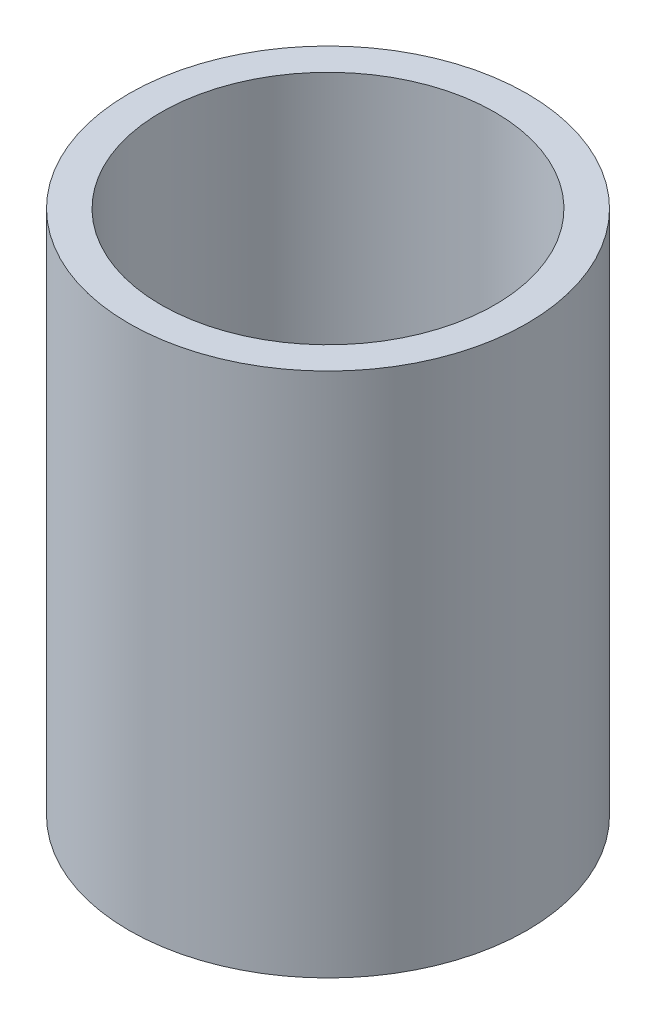
ISO-10303-21;
HEADER;
FILE_DESCRIPTION(('STEP AP214'),'2;1');
FILE_NAME('part.step','',(''),(''),'','','');
FILE_SCHEMA(('AUTOMOTIVE_DESIGN { 1 0 10303 214 1 1 1 1 }'));
ENDSEC;
DATA;
#1=APPLICATION_CONTEXT('core data for automotive mechanical design processes');
#2=APPLICATION_PROTOCOL_DEFINITION('international standard','automotive_design',2000,#1);
#3=PRODUCT_CONTEXT('',#1,'mechanical');
#4=PRODUCT('Part','Part','',(#3));
#5=PRODUCT_RELATED_PRODUCT_CATEGORY('part','',(#4));
#6=PRODUCT_DEFINITION_FORMATION('','',#4);
#7=PRODUCT_DEFINITION_CONTEXT('part definition',#1,'design');
#8=PRODUCT_DEFINITION('design','',#6,#7);
#9=PRODUCT_DEFINITION_SHAPE('','',#8);
#10=(LENGTH_UNIT() NAMED_UNIT(*) SI_UNIT(.MILLI.,.METRE.));
#11=(NAMED_UNIT(*) PLANE_ANGLE_UNIT() SI_UNIT($,.RADIAN.));
#12=(NAMED_UNIT(*) SI_UNIT($,.STERADIAN.) SOLID_ANGLE_UNIT());
#13=UNCERTAINTY_MEASURE_WITH_UNIT(LENGTH_MEASURE(1.E-05),#10,'distance_accuracy_value','');
#14=(GEOMETRIC_REPRESENTATION_CONTEXT(3) GLOBAL_UNCERTAINTY_ASSIGNED_CONTEXT((#13)) GLOBAL_UNIT_ASSIGNED_CONTEXT((#10,
#11,#12)) REPRESENTATION_CONTEXT('',''));
#15=CARTESIAN_POINT('',(0.,0.,0.));
#16=DIRECTION('',(0.,0.,1.));
#17=DIRECTION('',(1.,0.,0.));
#18=AXIS2_PLACEMENT_3D('',#15,#16,#17);
#19=CARTESIAN_POINT('',(0.,80.,0.));
#20=DIRECTION('',(0.,1.,0.));
#21=DIRECTION('',(0.,0.,1.));
#22=AXIS2_PLACEMENT_3D('',#19,#20,#21);
#23=PLANE('',#22);
#24=CARTESIAN_POINT('',(0.,80.,0.));
#25=DIRECTION('',(0.,1.,0.));
#26=DIRECTION('',(0.,0.,1.));
#27=AXIS2_PLACEMENT_3D('',#24,#25,#26);
#28=CIRCLE('',#27,30.3);
#29=CARTESIAN_POINT('',(0.,80.,30.3));
#30=VERTEX_POINT('',#29);
#31=EDGE_CURVE('E10',#30,#30,#28,.T.);
#32=ORIENTED_EDGE('',*,*,#31,.T.);
#33=EDGE_LOOP('',(#32));
#34=FACE_BOUND('',#33,.T.);
#35=CARTESIAN_POINT('',(0.,80.,0.));
#36=DIRECTION('',(0.,1.,0.));
#37=DIRECTION('',(0.,0.,1.));
#38=AXIS2_PLACEMENT_3D('',#35,#36,#37);
#39=CIRCLE('',#38,25.4);
#40=CARTESIAN_POINT('',(0.,80.,25.4));
#41=VERTEX_POINT('',#40);
#42=EDGE_CURVE('E54',#41,#41,#39,.T.);
#43=ORIENTED_EDGE('',*,*,#42,.F.);
#44=EDGE_LOOP('',(#43));
#45=FACE_BOUND('',#44,.T.);
#46=ADVANCED_FACE('F41',(#34,#45),#23,.T.);
#47=CARTESIAN_POINT('',(0.,0.,0.));
#48=DIRECTION('',(0.,1.,0.));
#49=DIRECTION('',(0.,0.,1.));
#50=AXIS2_PLACEMENT_3D('',#47,#48,#49);
#51=PLANE('',#50);
#52=CARTESIAN_POINT('',(0.,0.,0.));
#53=DIRECTION('',(0.,1.,0.));
#54=DIRECTION('',(0.,0.,1.));
#55=AXIS2_PLACEMENT_3D('',#52,#53,#54);
#56=CIRCLE('',#55,30.3);
#57=CARTESIAN_POINT('',(0.,0.,30.3));
#58=VERTEX_POINT('',#57);
#59=EDGE_CURVE('E45',#58,#58,#56,.T.);
#60=ORIENTED_EDGE('',*,*,#59,.F.);
#61=EDGE_LOOP('',(#60));
#62=FACE_BOUND('',#61,.T.);
#63=CARTESIAN_POINT('',(0.,0.,0.));
#64=DIRECTION('',(0.,1.,0.));
#65=DIRECTION('',(0.,0.,1.));
#66=AXIS2_PLACEMENT_3D('',#63,#64,#65);
#67=CIRCLE('',#66,25.4);
#68=CARTESIAN_POINT('',(0.,0.,25.4));
#69=VERTEX_POINT('',#68);
#70=EDGE_CURVE('E56',#69,#69,#67,.T.);
#71=ORIENTED_EDGE('',*,*,#70,.T.);
#72=EDGE_LOOP('',(#71));
#73=FACE_BOUND('',#72,.T.);
#74=ADVANCED_FACE('F68',(#62,#73),#51,.F.);
#75=CARTESIAN_POINT('',(0.,80.,0.));
#76=DIRECTION('',(0.,-1.,0.));
#77=DIRECTION('',(0.,0.,-1.));
#78=AXIS2_PLACEMENT_3D('',#75,#76,#77);
#79=CYLINDRICAL_SURFACE('',#78,30.3);
#80=ORIENTED_EDGE('',*,*,#31,.F.);
#81=EDGE_LOOP('',(#80));
#82=FACE_BOUND('',#81,.T.);
#83=ORIENTED_EDGE('',*,*,#59,.T.);
#84=EDGE_LOOP('',(#83));
#85=FACE_BOUND('',#84,.T.);
#86=ADVANCED_FACE('F43',(#82,#85),#79,.T.);
#87=CARTESIAN_POINT('',(0.,80.,0.));
#88=DIRECTION('',(0.,-1.,0.));
#89=DIRECTION('',(0.,0.,-1.));
#90=AXIS2_PLACEMENT_3D('',#87,#88,#89);
#91=CYLINDRICAL_SURFACE('',#90,25.4);
#92=ORIENTED_EDGE('',*,*,#42,.T.);
#93=EDGE_LOOP('',(#92));
#94=FACE_BOUND('',#93,.T.);
#95=ORIENTED_EDGE('',*,*,#70,.F.);
#96=EDGE_LOOP('',(#95));
#97=FACE_BOUND('',#96,.T.);
#98=ADVANCED_FACE('F64',(#94,#97),#91,.F.);
#99=CLOSED_SHELL('',(#46,#74,#86,#98));
#100=MANIFOLD_SOLID_BREP('B2',#99);
#101=ADVANCED_BREP_SHAPE_REPRESENTATION('',(#18,#100),#14);
#102=SHAPE_DEFINITION_REPRESENTATION(#9,#101);
ENDSEC;
END-ISO-10303-21;
